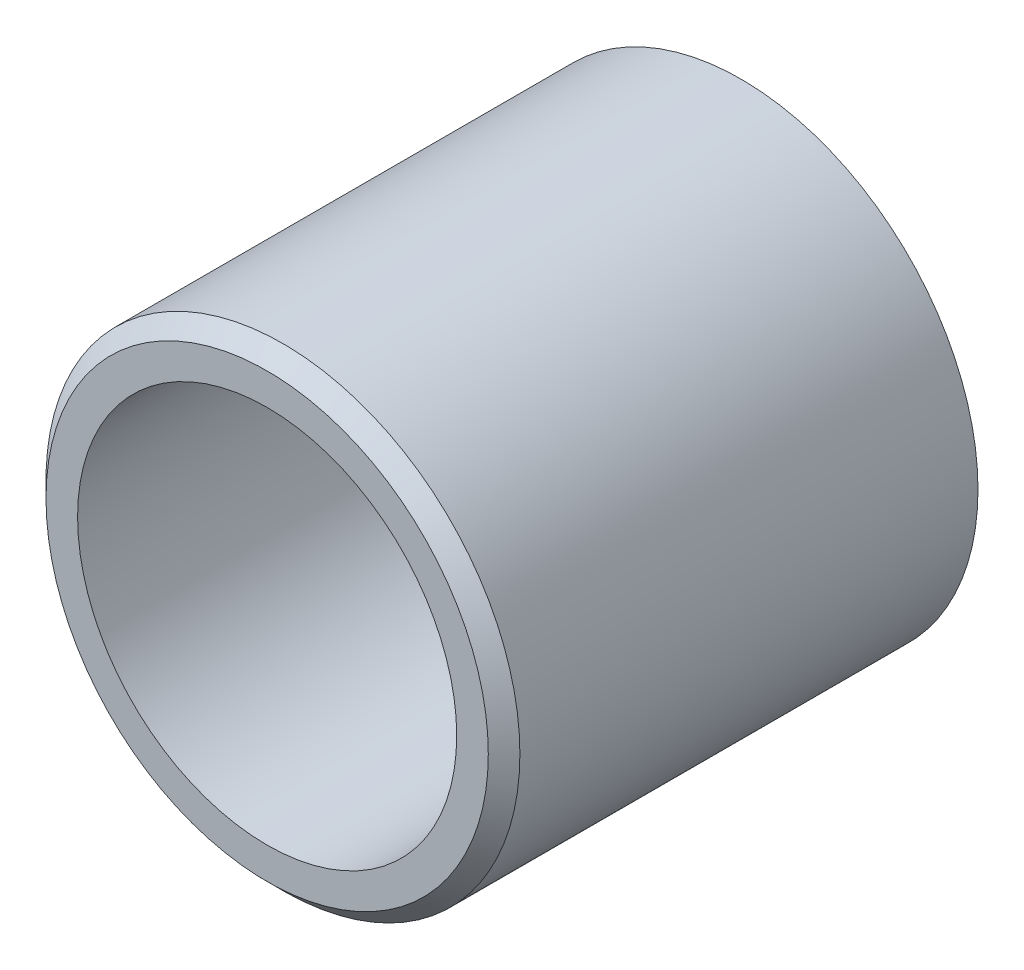
ISO-10303-21;
HEADER;
FILE_DESCRIPTION(('STEP AP214'),'2;1');
FILE_NAME('part.step','',(''),(''),'','','');
FILE_SCHEMA(('AUTOMOTIVE_DESIGN { 1 0 10303 214 1 1 1 1 }'));
ENDSEC;
DATA;
#1=APPLICATION_CONTEXT('core data for automotive mechanical design processes');
#2=APPLICATION_PROTOCOL_DEFINITION('international standard','automotive_design',2000,#1);
#3=PRODUCT_CONTEXT('',#1,'mechanical');
#4=PRODUCT('Part','Part','',(#3));
#5=PRODUCT_RELATED_PRODUCT_CATEGORY('part','',(#4));
#6=PRODUCT_DEFINITION_FORMATION('','',#4);
#7=PRODUCT_DEFINITION_CONTEXT('part definition',#1,'design');
#8=PRODUCT_DEFINITION('design','',#6,#7);
#9=PRODUCT_DEFINITION_SHAPE('','',#8);
#10=(LENGTH_UNIT() NAMED_UNIT(*) SI_UNIT(.MILLI.,.METRE.));
#11=(NAMED_UNIT(*) PLANE_ANGLE_UNIT() SI_UNIT($,.RADIAN.));
#12=(NAMED_UNIT(*) SI_UNIT($,.STERADIAN.) SOLID_ANGLE_UNIT());
#13=UNCERTAINTY_MEASURE_WITH_UNIT(LENGTH_MEASURE(1.E-05),#10,'distance_accuracy_value','');
#14=(GEOMETRIC_REPRESENTATION_CONTEXT(3) GLOBAL_UNCERTAINTY_ASSIGNED_CONTEXT((#13)) GLOBAL_UNIT_ASSIGNED_CONTEXT((#10,
#11,#12)) REPRESENTATION_CONTEXT('',''));
#15=CARTESIAN_POINT('',(0.,0.,0.));
#16=DIRECTION('',(0.,0.,1.));
#17=DIRECTION('',(1.,0.,0.));
#18=AXIS2_PLACEMENT_3D('',#15,#16,#17);
#19=CARTESIAN_POINT('',(0.,0.,15.));
#20=DIRECTION('',(0.,0.,1.));
#21=DIRECTION('',(1.,0.,0.));
#22=AXIS2_PLACEMENT_3D('',#19,#20,#21);
#23=PLANE('',#22);
#24=CARTESIAN_POINT('',(0.,0.,15.));
#25=DIRECTION('',(0.,0.,1.));
#26=DIRECTION('',(1.,0.,0.));
#27=AXIS2_PLACEMENT_3D('',#24,#25,#26);
#28=CIRCLE('',#27,7.);
#29=CARTESIAN_POINT('',(7.,0.,15.));
#30=VERTEX_POINT('',#29);
#31=EDGE_CURVE('E50',#30,#30,#28,.T.);
#32=ORIENTED_EDGE('',*,*,#31,.T.);
#33=EDGE_LOOP('',(#32));
#34=FACE_BOUND('',#33,.T.);
#35=CARTESIAN_POINT('',(0.,0.,15.));
#36=DIRECTION('',(0.,0.,1.));
#37=DIRECTION('',(1.,0.,0.));
#38=AXIS2_PLACEMENT_3D('',#35,#36,#37);
#39=CIRCLE('',#38,6.);
#40=CARTESIAN_POINT('',(6.,0.,15.));
#41=VERTEX_POINT('',#40);
#42=EDGE_CURVE('E60',#41,#41,#39,.T.);
#43=ORIENTED_EDGE('',*,*,#42,.F.);
#44=EDGE_LOOP('',(#43));
#45=FACE_BOUND('',#44,.T.);
#46=ADVANCED_FACE('F41',(#34,#45),#23,.T.);
#47=CARTESIAN_POINT('',(0.,0.,0.));
#48=DIRECTION('',(0.,0.,1.));
#49=DIRECTION('',(1.,0.,0.));
#50=AXIS2_PLACEMENT_3D('',#47,#48,#49);
#51=PLANE('',#50);
#52=CARTESIAN_POINT('',(0.,0.,0.));
#53=DIRECTION('',(0.,0.,1.));
#54=DIRECTION('',(1.,0.,0.));
#55=AXIS2_PLACEMENT_3D('',#52,#53,#54);
#56=CIRCLE('',#55,7.5);
#57=CARTESIAN_POINT('',(7.5,0.,0.));
#58=VERTEX_POINT('',#57);
#59=EDGE_CURVE('E55',#58,#58,#56,.T.);
#60=ORIENTED_EDGE('',*,*,#59,.F.);
#61=EDGE_LOOP('',(#60));
#62=FACE_BOUND('',#61,.T.);
#63=CARTESIAN_POINT('',(0.,0.,0.));
#64=DIRECTION('',(0.,0.,1.));
#65=DIRECTION('',(1.,0.,0.));
#66=AXIS2_PLACEMENT_3D('',#63,#64,#65);
#67=CIRCLE('',#66,6.);
#68=CARTESIAN_POINT('',(6.,0.,0.));
#69=VERTEX_POINT('',#68);
#70=EDGE_CURVE('E63',#69,#69,#67,.T.);
#71=ORIENTED_EDGE('',*,*,#70,.T.);
#72=EDGE_LOOP('',(#71));
#73=FACE_BOUND('',#72,.T.);
#74=ADVANCED_FACE('F75',(#62,#73),#51,.F.);
#75=CARTESIAN_POINT('',(0.,0.,15.));
#76=DIRECTION('',(0.,0.,-1.));
#77=DIRECTION('',(-1.,0.,0.));
#78=AXIS2_PLACEMENT_3D('',#75,#76,#77);
#79=CYLINDRICAL_SURFACE('',#78,7.5);
#80=CARTESIAN_POINT('',(0.,0.,14.5));
#81=DIRECTION('',(0.,0.,1.));
#82=DIRECTION('',(1.,0.,0.));
#83=AXIS2_PLACEMENT_3D('',#80,#81,#82);
#84=CIRCLE('',#83,7.5);
#85=CARTESIAN_POINT('',(7.5,0.,14.5));
#86=VERTEX_POINT('',#85);
#87=EDGE_CURVE('E10',#86,#86,#84,.F.);
#88=ORIENTED_EDGE('',*,*,#87,.T.);
#89=EDGE_LOOP('',(#88));
#90=FACE_BOUND('',#89,.T.);
#91=ORIENTED_EDGE('',*,*,#59,.T.);
#92=EDGE_LOOP('',(#91));
#93=FACE_BOUND('',#92,.T.);
#94=ADVANCED_FACE('F80',(#90,#93),#79,.T.);
#95=CARTESIAN_POINT('',(0.,0.,15.));
#96=DIRECTION('',(0.,0.,-1.));
#97=DIRECTION('',(-1.,0.,0.));
#98=AXIS2_PLACEMENT_3D('',#95,#96,#97);
#99=CYLINDRICAL_SURFACE('',#98,6.);
#100=ORIENTED_EDGE('',*,*,#42,.T.);
#101=EDGE_LOOP('',(#100));
#102=FACE_BOUND('',#101,.T.);
#103=ORIENTED_EDGE('',*,*,#70,.F.);
#104=EDGE_LOOP('',(#103));
#105=FACE_BOUND('',#104,.T.);
#106=ADVANCED_FACE('F71',(#102,#105),#99,.F.);
#107=CARTESIAN_POINT('',(0.,0.,15.));
#108=DIRECTION('',(0.,0.,-1.));
#109=DIRECTION('',(-1.,0.,0.));
#110=AXIS2_PLACEMENT_3D('',#107,#108,#109);
#111=CONICAL_SURFACE('',#110,7.,0.785398163397447);
#112=ORIENTED_EDGE('',*,*,#87,.F.);
#113=EDGE_LOOP('',(#112));
#114=FACE_BOUND('',#113,.T.);
#115=ORIENTED_EDGE('',*,*,#31,.F.);
#116=EDGE_LOOP('',(#115));
#117=FACE_BOUND('',#116,.T.);
#118=ADVANCED_FACE('F44',(#114,#117),#111,.T.);
#119=CLOSED_SHELL('',(#46,#74,#94,#106,#118));
#120=MANIFOLD_SOLID_BREP('B2',#119);
#121=ADVANCED_BREP_SHAPE_REPRESENTATION('',(#18,#120),#14);
#122=SHAPE_DEFINITION_REPRESENTATION(#9,#121);
ENDSEC;
END-ISO-10303-21;
